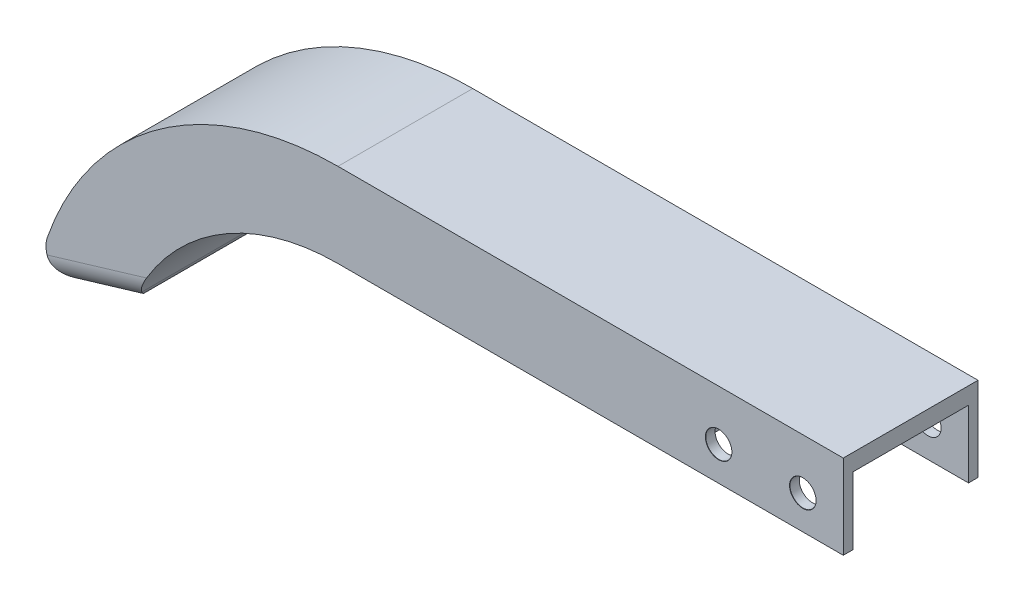
ISO-10303-21;
HEADER;
FILE_DESCRIPTION(('STEP AP214'),'2;1');
FILE_NAME('part.step','',(''),(''),'','','');
FILE_SCHEMA(('AUTOMOTIVE_DESIGN { 1 0 10303 214 1 1 1 1 }'));
ENDSEC;
DATA;
#1=APPLICATION_CONTEXT('core data for automotive mechanical design processes');
#2=APPLICATION_PROTOCOL_DEFINITION('international standard','automotive_design',2000,#1);
#3=PRODUCT_CONTEXT('',#1,'mechanical');
#4=PRODUCT('Part','Part','',(#3));
#5=PRODUCT_RELATED_PRODUCT_CATEGORY('part','',(#4));
#6=PRODUCT_DEFINITION_FORMATION('','',#4);
#7=PRODUCT_DEFINITION_CONTEXT('part definition',#1,'design');
#8=PRODUCT_DEFINITION('design','',#6,#7);
#9=PRODUCT_DEFINITION_SHAPE('','',#8);
#10=(LENGTH_UNIT() NAMED_UNIT(*) SI_UNIT(.MILLI.,.METRE.));
#11=(NAMED_UNIT(*) PLANE_ANGLE_UNIT() SI_UNIT($,.RADIAN.));
#12=(NAMED_UNIT(*) SI_UNIT($,.STERADIAN.) SOLID_ANGLE_UNIT());
#13=UNCERTAINTY_MEASURE_WITH_UNIT(LENGTH_MEASURE(1.E-05),#10,'distance_accuracy_value','');
#14=(GEOMETRIC_REPRESENTATION_CONTEXT(3) GLOBAL_UNCERTAINTY_ASSIGNED_CONTEXT((#13)) GLOBAL_UNIT_ASSIGNED_CONTEXT((#10,
#11,#12)) REPRESENTATION_CONTEXT('',''));
#15=CARTESIAN_POINT('',(0.,0.,0.));
#16=DIRECTION('',(0.,0.,1.));
#17=DIRECTION('',(1.,0.,0.));
#18=AXIS2_PLACEMENT_3D('',#15,#16,#17);
#19=CARTESIAN_POINT('',(-30.,10.,8.));
#20=DIRECTION('',(0.,0.,-1.));
#21=DIRECTION('',(-1.,0.,0.));
#22=AXIS2_PLACEMENT_3D('',#19,#20,#21);
#23=PLANE('',#22);
#24=CARTESIAN_POINT('',(15.2,4.,8.));
#25=DIRECTION('',(0.,0.,1.));
#26=DIRECTION('',(1.,0.,0.));
#27=AXIS2_PLACEMENT_3D('',#24,#25,#26);
#28=CIRCLE('',#27,1.575);
#29=CARTESIAN_POINT('',(16.775,4.,8.));
#30=VERTEX_POINT('',#29);
#31=EDGE_CURVE('E164',#30,#30,#28,.T.);
#32=ORIENTED_EDGE('',*,*,#31,.F.);
#33=EDGE_LOOP('',(#32));
#34=FACE_BOUND('',#33,.T.);
#35=CARTESIAN_POINT('',(25.2,4.,8.));
#36=DIRECTION('',(0.,0.,1.));
#37=DIRECTION('',(1.,0.,0.));
#38=AXIS2_PLACEMENT_3D('',#35,#36,#37);
#39=CIRCLE('',#38,1.575);
#40=CARTESIAN_POINT('',(26.775,4.,8.));
#41=VERTEX_POINT('',#40);
#42=EDGE_CURVE('E388',#41,#41,#39,.T.);
#43=ORIENTED_EDGE('',*,*,#42,.F.);
#44=EDGE_LOOP('',(#43));
#45=FACE_BOUND('',#44,.T.);
#46=CARTESIAN_POINT('',(-30.,-26.5304551873512,8.));
#47=DIRECTION('',(0.,0.,1.));
#48=DIRECTION('',(1.,0.,0.));
#49=AXIS2_PLACEMENT_3D('',#46,#47,#48);
#50=CIRCLE('',#49,36.5304551873512);
#51=CARTESIAN_POINT('',(-30.,9.99999999999999,8.));
#52=VERTEX_POINT('',#51);
#53=CARTESIAN_POINT('',(-64.5073787930309,-14.5423375273783,8.));
#54=VERTEX_POINT('',#53);
#55=EDGE_CURVE('E147',#52,#54,#50,.T.);
#56=ORIENTED_EDGE('',*,*,#55,.T.);
#57=CARTESIAN_POINT('',(-61.6735204179254,-15.5268408081469,8.));
#58=DIRECTION('',(0.,0.,-1.));
#59=DIRECTION('',(-1.,0.,0.));
#60=AXIS2_PLACEMENT_3D('',#57,#58,#59);
#61=CIRCLE('',#60,3.);
#62=CARTESIAN_POINT('',(-64.5475818728086,-16.38694007774,8.));
#63=VERTEX_POINT('',#62);
#64=EDGE_CURVE('E13',#54,#63,#61,.F.);
#65=ORIENTED_EDGE('',*,*,#64,.T.);
#66=DIRECTION('',(0.958020484961071,0.286699756531034,0.));
#67=VECTOR('',#66,1.);
#68=CARTESIAN_POINT('',(-55.4352110843268,-13.6599477769602,8.));
#69=LINE('',#68,#67);
#70=CARTESIAN_POINT('',(-52.7318155012241,-12.8509224297474,8.));
#71=VERTEX_POINT('',#70);
#72=EDGE_CURVE('E56',#63,#71,#69,.T.);
#73=ORIENTED_EDGE('',*,*,#72,.T.);
#74=CARTESIAN_POINT('',(-30.,-26.5304551873512,8.));
#75=DIRECTION('',(0.,0.,-1.));
#76=DIRECTION('',(1.,0.,0.));
#77=AXIS2_PLACEMENT_3D('',#74,#75,#76);
#78=CIRCLE('',#77,26.5304551873512);
#79=CARTESIAN_POINT('',(-30.,0.,8.));
#80=VERTEX_POINT('',#79);
#81=EDGE_CURVE('E154',#71,#80,#78,.T.);
#82=ORIENTED_EDGE('',*,*,#81,.T.);
#83=DIRECTION('',(1.,0.,0.));
#84=VECTOR('',#83,1.);
#85=CARTESIAN_POINT('',(-30.,0.,8.));
#86=LINE('',#85,#84);
#87=CARTESIAN_POINT('',(30.,0.,8.));
#88=VERTEX_POINT('',#87);
#89=EDGE_CURVE('E186',#80,#88,#86,.T.);
#90=ORIENTED_EDGE('',*,*,#89,.T.);
#91=DIRECTION('',(0.,-1.,0.));
#92=VECTOR('',#91,1.);
#93=CARTESIAN_POINT('',(30.,10.,8.));
#94=LINE('',#93,#92);
#95=CARTESIAN_POINT('',(30.,10.,8.));
#96=VERTEX_POINT('',#95);
#97=EDGE_CURVE('E167',#96,#88,#94,.T.);
#98=ORIENTED_EDGE('',*,*,#97,.F.);
#99=DIRECTION('',(1.,0.,0.));
#100=VECTOR('',#99,1.);
#101=CARTESIAN_POINT('',(-30.,10.,8.));
#102=LINE('',#101,#100);
#103=EDGE_CURVE('E159',#52,#96,#102,.T.);
#104=ORIENTED_EDGE('',*,*,#103,.F.);
#105=EDGE_LOOP('',(#56,#65,#73,#82,#90,#98,#104));
#106=FACE_BOUND('',#105,.T.);
#107=ADVANCED_FACE('F45',(#34,#45,#106),#23,.F.);
#108=CARTESIAN_POINT('',(0.,10.,0.));
#109=DIRECTION('',(0.,1.,0.));
#110=DIRECTION('',(0.,0.,1.));
#111=AXIS2_PLACEMENT_3D('',#108,#109,#110);
#112=PLANE('',#111);
#113=DIRECTION('',(-1.,0.,0.));
#114=VECTOR('',#113,1.);
#115=CARTESIAN_POINT('',(-30.,10.,-8.));
#116=LINE('',#115,#114);
#117=CARTESIAN_POINT('',(30.,10.,-8.));
#118=VERTEX_POINT('',#117);
#119=CARTESIAN_POINT('',(-30.,9.99999999999999,-8.));
#120=VERTEX_POINT('',#119);
#121=EDGE_CURVE('E161',#118,#120,#116,.T.);
#122=ORIENTED_EDGE('',*,*,#121,.T.);
#123=DIRECTION('',(0.,0.,1.));
#124=VECTOR('',#123,1.);
#125=CARTESIAN_POINT('',(-30.,9.99999999999999,-8.));
#126=LINE('',#125,#124);
#127=EDGE_CURVE('E150',#120,#52,#126,.T.);
#128=ORIENTED_EDGE('',*,*,#127,.T.);
#129=ORIENTED_EDGE('',*,*,#103,.T.);
#130=DIRECTION('',(0.,0.,-1.));
#131=VECTOR('',#130,1.);
#132=CARTESIAN_POINT('',(30.,10.,-8.));
#133=LINE('',#132,#131);
#134=EDGE_CURVE('E175',#96,#118,#133,.T.);
#135=ORIENTED_EDGE('',*,*,#134,.T.);
#136=EDGE_LOOP('',(#122,#128,#129,#135));
#137=FACE_BOUND('',#136,.T.);
#138=ADVANCED_FACE('F157',(#137),#112,.T.);
#139=CARTESIAN_POINT('',(-30.,-100.27043880632,-8.));
#140=DIRECTION('',(-8.67813232164608E-07,0.,-0.999999999999623));
#141=DIRECTION('',(-0.999999999999624,0.,8.67813232164609E-07));
#142=AXIS2_PLACEMENT_3D('',#139,#140,#141);
#143=PLANE('',#142);
#144=CARTESIAN_POINT('',(-30.,-26.5304551873512,-8.));
#145=DIRECTION('',(-8.67813232164608E-07,0.,-0.999999999999623));
#146=DIRECTION('',(-0.999999999999624,0.,8.67813232164608E-07));
#147=AXIS2_PLACEMENT_3D('',#144,#145,#146);
#148=ELLIPSE('',#147,26.5304551873612,26.5304551873512);
#149=CARTESIAN_POINT('',(-30.,0.,-8.));
#150=VERTEX_POINT('',#149);
#151=CARTESIAN_POINT('',(-52.7318149293887,-12.8509214795061,-7.99998027303021));
#152=VERTEX_POINT('',#151);
#153=EDGE_CURVE('E218',#150,#152,#148,.F.);
#154=ORIENTED_EDGE('',*,*,#153,.T.);
#155=DIRECTION('',(-0.95802048496074,-0.286699756530935,8.31382853533999E-07));
#156=VECTOR('',#155,1.);
#157=CARTESIAN_POINT('',(-55.8794965871427,-13.7929050582309,-7.99997754143042));
#158=LINE('',#157,#156);
#159=CARTESIAN_POINT('',(-64.5475820868028,-16.3869393626683,-7.99997001915113));
#160=VERTEX_POINT('',#159);
#161=EDGE_CURVE('E225',#152,#160,#158,.T.);
#162=ORIENTED_EDGE('',*,*,#161,.T.);
#163=CARTESIAN_POINT('',(-61.6735204179254,-15.5268408081469,-7.99997251329987));
#164=DIRECTION('',(-8.67813232164608E-07,0.,-0.999999999999623));
#165=DIRECTION('',(-0.999999999999624,0.,8.67813232164609E-07));
#166=AXIS2_PLACEMENT_3D('',#163,#164,#165);
#167=CIRCLE('',#166,3.);
#168=CARTESIAN_POINT('',(-64.507378793031,-14.5423375273783,-7.99997005404008));
#169=VERTEX_POINT('',#168);
#170=EDGE_CURVE('E222',#160,#169,#167,.T.);
#171=ORIENTED_EDGE('',*,*,#170,.T.);
#172=CARTESIAN_POINT('',(-30.,-26.5304551873512,-8.));
#173=DIRECTION('',(-8.67813232164608E-07,0.,-0.999999999999623));
#174=DIRECTION('',(-0.999999999999624,0.,8.67813232164608E-07));
#175=AXIS2_PLACEMENT_3D('',#172,#173,#174);
#176=ELLIPSE('',#175,36.530455187365,36.5304551873512);
#177=EDGE_CURVE('E194',#169,#120,#176,.T.);
#178=ORIENTED_EDGE('',*,*,#177,.T.);
#179=DIRECTION('',(0.,-1.,0.));
#180=VECTOR('',#179,1.);
#181=CARTESIAN_POINT('',(-30.,10.,-8.));
#182=LINE('',#181,#180);
#183=EDGE_CURVE('E173',#120,#150,#182,.T.);
#184=ORIENTED_EDGE('',*,*,#183,.T.);
#185=EDGE_LOOP('',(#154,#162,#171,#178,#184));
#186=FACE_BOUND('',#185,.T.);
#187=ADVANCED_FACE('F273',(#186),#143,.T.);
#188=CARTESIAN_POINT('',(30.,10.,-8.));
#189=DIRECTION('',(-1.,0.,0.));
#190=DIRECTION('',(0.,0.,1.));
#191=AXIS2_PLACEMENT_3D('',#188,#189,#190);
#192=PLANE('',#191);
#193=DIRECTION('',(0.,-1.,0.));
#194=VECTOR('',#193,1.);
#195=CARTESIAN_POINT('',(30.,8.,-6.873));
#196=LINE('',#195,#194);
#197=CARTESIAN_POINT('',(30.,8.,-6.873));
#198=VERTEX_POINT('',#197);
#199=CARTESIAN_POINT('',(30.,0.,-6.873));
#200=VERTEX_POINT('',#199);
#201=EDGE_CURVE('E435',#198,#200,#196,.T.);
#202=ORIENTED_EDGE('',*,*,#201,.T.);
#203=DIRECTION('',(0.,0.,-1.));
#204=VECTOR('',#203,1.);
#205=CARTESIAN_POINT('',(30.,0.,-8.));
#206=LINE('',#205,#204);
#207=CARTESIAN_POINT('',(30.,0.,-8.));
#208=VERTEX_POINT('',#207);
#209=EDGE_CURVE('E185',#200,#208,#206,.T.);
#210=ORIENTED_EDGE('',*,*,#209,.T.);
#211=DIRECTION('',(0.,-1.,0.));
#212=VECTOR('',#211,1.);
#213=CARTESIAN_POINT('',(30.,10.,-8.));
#214=LINE('',#213,#212);
#215=EDGE_CURVE('E190',#118,#208,#214,.T.);
#216=ORIENTED_EDGE('',*,*,#215,.F.);
#217=ORIENTED_EDGE('',*,*,#134,.F.);
#218=ORIENTED_EDGE('',*,*,#97,.T.);
#219=CARTESIAN_POINT('',(30.,0.,6.873));
#220=VERTEX_POINT('',#219);
#221=EDGE_CURVE('E180',#88,#220,#206,.T.);
#222=ORIENTED_EDGE('',*,*,#221,.T.);
#223=DIRECTION('',(0.,-1.,0.));
#224=VECTOR('',#223,1.);
#225=CARTESIAN_POINT('',(30.,8.,6.873));
#226=LINE('',#225,#224);
#227=CARTESIAN_POINT('',(30.,8.,6.873));
#228=VERTEX_POINT('',#227);
#229=EDGE_CURVE('E417',#228,#220,#226,.T.);
#230=ORIENTED_EDGE('',*,*,#229,.F.);
#231=DIRECTION('',(0.,0.,-1.));
#232=VECTOR('',#231,1.);
#233=CARTESIAN_POINT('',(30.,8.,6.873));
#234=LINE('',#233,#232);
#235=EDGE_CURVE('E403',#228,#198,#234,.T.);
#236=ORIENTED_EDGE('',*,*,#235,.T.);
#237=EDGE_LOOP('',(#202,#210,#216,#217,#218,#222,#230,#236));
#238=FACE_BOUND('',#237,.T.);
#239=ADVANCED_FACE('F276',(#238),#192,.F.);
#240=CARTESIAN_POINT('',(0.,0.,0.));
#241=DIRECTION('',(0.,1.,0.));
#242=DIRECTION('',(0.,0.,1.));
#243=AXIS2_PLACEMENT_3D('',#240,#241,#242);
#244=PLANE('',#243);
#245=DIRECTION('',(-1.,0.,0.));
#246=VECTOR('',#245,1.);
#247=CARTESIAN_POINT('',(30.,0.,-6.873));
#248=LINE('',#247,#246);
#249=CARTESIAN_POINT('',(9.746,0.,-6.873));
#250=VERTEX_POINT('',#249);
#251=EDGE_CURVE('E402',#200,#250,#248,.T.);
#252=ORIENTED_EDGE('',*,*,#251,.T.);
#253=DIRECTION('',(0.,0.,1.));
#254=VECTOR('',#253,1.);
#255=CARTESIAN_POINT('',(9.746,0.,6.873));
#256=LINE('',#255,#254);
#257=CARTESIAN_POINT('',(9.746,0.,6.873));
#258=VERTEX_POINT('',#257);
#259=EDGE_CURVE('E421',#250,#258,#256,.T.);
#260=ORIENTED_EDGE('',*,*,#259,.T.);
#261=DIRECTION('',(1.,0.,0.));
#262=VECTOR('',#261,1.);
#263=CARTESIAN_POINT('',(30.,0.,6.873));
#264=LINE('',#263,#262);
#265=EDGE_CURVE('E408',#258,#220,#264,.T.);
#266=ORIENTED_EDGE('',*,*,#265,.T.);
#267=ORIENTED_EDGE('',*,*,#221,.F.);
#268=ORIENTED_EDGE('',*,*,#89,.F.);
#269=DIRECTION('',(0.,0.,1.));
#270=VECTOR('',#269,1.);
#271=CARTESIAN_POINT('',(-30.,0.,-8.));
#272=LINE('',#271,#270);
#273=EDGE_CURVE('E188',#150,#80,#272,.T.);
#274=ORIENTED_EDGE('',*,*,#273,.F.);
#275=DIRECTION('',(-1.,0.,0.));
#276=VECTOR('',#275,1.);
#277=CARTESIAN_POINT('',(-30.,0.,-8.));
#278=LINE('',#277,#276);
#279=EDGE_CURVE('E184',#208,#150,#278,.T.);
#280=ORIENTED_EDGE('',*,*,#279,.F.);
#281=ORIENTED_EDGE('',*,*,#209,.F.);
#282=EDGE_LOOP('',(#252,#260,#266,#267,#268,#274,#280,#281));
#283=FACE_BOUND('',#282,.T.);
#284=ADVANCED_FACE('F314',(#283),#244,.F.);
#285=CARTESIAN_POINT('',(-30.,10.,-8.));
#286=DIRECTION('',(0.,0.,1.));
#287=DIRECTION('',(1.,0.,0.));
#288=AXIS2_PLACEMENT_3D('',#285,#286,#287);
#289=PLANE('',#288);
#290=CARTESIAN_POINT('',(15.2,4.,-8.));
#291=DIRECTION('',(0.,0.,1.));
#292=DIRECTION('',(1.,0.,0.));
#293=AXIS2_PLACEMENT_3D('',#290,#291,#292);
#294=CIRCLE('',#293,1.55);
#295=CARTESIAN_POINT('',(16.75,4.,-8.));
#296=VERTEX_POINT('',#295);
#297=EDGE_CURVE('E205',#296,#296,#294,.T.);
#298=ORIENTED_EDGE('',*,*,#297,.T.);
#299=EDGE_LOOP('',(#298));
#300=FACE_BOUND('',#299,.T.);
#301=CARTESIAN_POINT('',(25.2,4.,-8.));
#302=DIRECTION('',(0.,0.,1.));
#303=DIRECTION('',(1.,0.,0.));
#304=AXIS2_PLACEMENT_3D('',#301,#302,#303);
#305=CIRCLE('',#304,1.55);
#306=CARTESIAN_POINT('',(26.75,4.,-8.));
#307=VERTEX_POINT('',#306);
#308=EDGE_CURVE('E200',#307,#307,#305,.T.);
#309=ORIENTED_EDGE('',*,*,#308,.T.);
#310=EDGE_LOOP('',(#309));
#311=FACE_BOUND('',#310,.T.);
#312=ORIENTED_EDGE('',*,*,#279,.T.);
#313=ORIENTED_EDGE('',*,*,#183,.F.);
#314=ORIENTED_EDGE('',*,*,#121,.F.);
#315=ORIENTED_EDGE('',*,*,#215,.T.);
#316=EDGE_LOOP('',(#312,#313,#314,#315));
#317=FACE_BOUND('',#316,.T.);
#318=ADVANCED_FACE('F310',(#300,#311,#317),#289,.F.);
#319=CARTESIAN_POINT('',(30.,8.,-6.873));
#320=DIRECTION('',(0.,0.,1.));
#321=DIRECTION('',(1.,0.,0.));
#322=AXIS2_PLACEMENT_3D('',#319,#320,#321);
#323=PLANE('',#322);
#324=CARTESIAN_POINT('',(15.2,4.,-6.873));
#325=DIRECTION('',(0.,0.,1.));
#326=DIRECTION('',(1.,0.,0.));
#327=AXIS2_PLACEMENT_3D('',#324,#325,#326);
#328=CIRCLE('',#327,1.55);
#329=CARTESIAN_POINT('',(16.75,4.,-6.873));
#330=VERTEX_POINT('',#329);
#331=EDGE_CURVE('E204',#330,#330,#328,.T.);
#332=ORIENTED_EDGE('',*,*,#331,.F.);
#333=EDGE_LOOP('',(#332));
#334=FACE_BOUND('',#333,.T.);
#335=CARTESIAN_POINT('',(25.2,4.,-6.873));
#336=DIRECTION('',(0.,0.,1.));
#337=DIRECTION('',(1.,0.,0.));
#338=AXIS2_PLACEMENT_3D('',#335,#336,#337);
#339=CIRCLE('',#338,1.55);
#340=CARTESIAN_POINT('',(26.75,4.,-6.873));
#341=VERTEX_POINT('',#340);
#342=EDGE_CURVE('E199',#341,#341,#339,.T.);
#343=ORIENTED_EDGE('',*,*,#342,.F.);
#344=EDGE_LOOP('',(#343));
#345=FACE_BOUND('',#344,.T.);
#346=ORIENTED_EDGE('',*,*,#251,.F.);
#347=ORIENTED_EDGE('',*,*,#201,.F.);
#348=DIRECTION('',(-1.,0.,0.));
#349=VECTOR('',#348,1.);
#350=CARTESIAN_POINT('',(30.,8.,-6.873));
#351=LINE('',#350,#349);
#352=CARTESIAN_POINT('',(9.746,8.,-6.873));
#353=VERTEX_POINT('',#352);
#354=EDGE_CURVE('E407',#198,#353,#351,.T.);
#355=ORIENTED_EDGE('',*,*,#354,.T.);
#356=DIRECTION('',(0.,-1.,0.));
#357=VECTOR('',#356,1.);
#358=CARTESIAN_POINT('',(9.746,8.,-6.873));
#359=LINE('',#358,#357);
#360=EDGE_CURVE('E433',#353,#250,#359,.T.);
#361=ORIENTED_EDGE('',*,*,#360,.T.);
#362=EDGE_LOOP('',(#346,#347,#355,#361));
#363=FACE_BOUND('',#362,.T.);
#364=ADVANCED_FACE('F306',(#334,#345,#363),#323,.T.);
#365=CARTESIAN_POINT('',(9.746,8.,6.873));
#366=DIRECTION('',(1.,0.,0.));
#367=DIRECTION('',(0.,0.,-1.));
#368=AXIS2_PLACEMENT_3D('',#365,#366,#367);
#369=PLANE('',#368);
#370=ORIENTED_EDGE('',*,*,#259,.F.);
#371=ORIENTED_EDGE('',*,*,#360,.F.);
#372=DIRECTION('',(0.,0.,1.));
#373=VECTOR('',#372,1.);
#374=CARTESIAN_POINT('',(9.746,8.,6.873));
#375=LINE('',#374,#373);
#376=CARTESIAN_POINT('',(9.746,8.,6.873));
#377=VERTEX_POINT('',#376);
#378=EDGE_CURVE('E411',#353,#377,#375,.T.);
#379=ORIENTED_EDGE('',*,*,#378,.T.);
#380=DIRECTION('',(0.,-1.,0.));
#381=VECTOR('',#380,1.);
#382=CARTESIAN_POINT('',(9.746,8.,6.873));
#383=LINE('',#382,#381);
#384=EDGE_CURVE('E430',#377,#258,#383,.T.);
#385=ORIENTED_EDGE('',*,*,#384,.T.);
#386=EDGE_LOOP('',(#370,#371,#379,#385));
#387=FACE_BOUND('',#386,.T.);
#388=ADVANCED_FACE('F302',(#387),#369,.T.);
#389=CARTESIAN_POINT('',(30.,8.,6.873));
#390=DIRECTION('',(0.,0.,-1.));
#391=DIRECTION('',(-1.,0.,0.));
#392=AXIS2_PLACEMENT_3D('',#389,#390,#391);
#393=PLANE('',#392);
#394=CARTESIAN_POINT('',(15.2,4.,6.873));
#395=DIRECTION('',(0.,0.,-1.));
#396=DIRECTION('',(-1.,0.,0.));
#397=AXIS2_PLACEMENT_3D('',#394,#395,#396);
#398=CIRCLE('',#397,1.55);
#399=CARTESIAN_POINT('',(13.65,4.,6.873));
#400=VERTEX_POINT('',#399);
#401=EDGE_CURVE('E201',#400,#400,#398,.T.);
#402=ORIENTED_EDGE('',*,*,#401,.F.);
#403=EDGE_LOOP('',(#402));
#404=FACE_BOUND('',#403,.T.);
#405=CARTESIAN_POINT('',(25.2,4.,6.873));
#406=DIRECTION('',(0.,0.,-1.));
#407=DIRECTION('',(-1.,0.,0.));
#408=AXIS2_PLACEMENT_3D('',#405,#406,#407);
#409=CIRCLE('',#408,1.55);
#410=CARTESIAN_POINT('',(23.65,4.,6.873));
#411=VERTEX_POINT('',#410);
#412=EDGE_CURVE('E195',#411,#411,#409,.T.);
#413=ORIENTED_EDGE('',*,*,#412,.F.);
#414=EDGE_LOOP('',(#413));
#415=FACE_BOUND('',#414,.T.);
#416=ORIENTED_EDGE('',*,*,#265,.F.);
#417=ORIENTED_EDGE('',*,*,#384,.F.);
#418=DIRECTION('',(1.,0.,0.));
#419=VECTOR('',#418,1.);
#420=CARTESIAN_POINT('',(30.,8.,6.873));
#421=LINE('',#420,#419);
#422=EDGE_CURVE('E414',#377,#228,#421,.T.);
#423=ORIENTED_EDGE('',*,*,#422,.T.);
#424=ORIENTED_EDGE('',*,*,#229,.T.);
#425=EDGE_LOOP('',(#416,#417,#423,#424));
#426=FACE_BOUND('',#425,.T.);
#427=ADVANCED_FACE('F298',(#404,#415,#426),#393,.T.);
#428=CARTESIAN_POINT('',(0.,8.,0.));
#429=DIRECTION('',(0.,1.,0.));
#430=DIRECTION('',(0.,0.,1.));
#431=AXIS2_PLACEMENT_3D('',#428,#429,#430);
#432=PLANE('',#431);
#433=ORIENTED_EDGE('',*,*,#235,.F.);
#434=ORIENTED_EDGE('',*,*,#422,.F.);
#435=ORIENTED_EDGE('',*,*,#378,.F.);
#436=ORIENTED_EDGE('',*,*,#354,.F.);
#437=EDGE_LOOP('',(#433,#434,#435,#436));
#438=FACE_BOUND('',#437,.T.);
#439=ADVANCED_FACE('F294',(#438),#432,.F.);
#440=CARTESIAN_POINT('',(25.2,4.,8.));
#441=DIRECTION('',(0.,0.,1.));
#442=DIRECTION('',(1.,0.,0.));
#443=AXIS2_PLACEMENT_3D('',#440,#441,#442);
#444=CYLINDRICAL_SURFACE('',#443,1.55);
#445=ORIENTED_EDGE('',*,*,#412,.T.);
#446=EDGE_LOOP('',(#445));
#447=FACE_BOUND('',#446,.T.);
#448=CARTESIAN_POINT('',(25.2,4.,7.975));
#449=DIRECTION('',(0.,0.,1.));
#450=DIRECTION('',(1.,0.,0.));
#451=AXIS2_PLACEMENT_3D('',#448,#449,#450);
#452=CIRCLE('',#451,1.55);
#453=CARTESIAN_POINT('',(26.75,4.,7.975));
#454=VERTEX_POINT('',#453);
#455=EDGE_CURVE('E392',#454,#454,#452,.T.);
#456=ORIENTED_EDGE('',*,*,#455,.T.);
#457=EDGE_LOOP('',(#456));
#458=FACE_BOUND('',#457,.T.);
#459=ADVANCED_FACE('F290',(#447,#458),#444,.F.);
#460=CARTESIAN_POINT('',(25.2,4.,8.));
#461=DIRECTION('',(0.,0.,1.));
#462=DIRECTION('',(1.,0.,0.));
#463=AXIS2_PLACEMENT_3D('',#460,#461,#462);
#464=CONICAL_SURFACE('',#463,1.575,0.785398163397448);
#465=ORIENTED_EDGE('',*,*,#455,.F.);
#466=EDGE_LOOP('',(#465));
#467=FACE_BOUND('',#466,.T.);
#468=ORIENTED_EDGE('',*,*,#42,.T.);
#469=EDGE_LOOP('',(#468));
#470=FACE_BOUND('',#469,.T.);
#471=ADVANCED_FACE('F287',(#467,#470),#464,.F.);
#472=ORIENTED_EDGE('',*,*,#342,.T.);
#473=EDGE_LOOP('',(#472));
#474=FACE_BOUND('',#473,.T.);
#475=ORIENTED_EDGE('',*,*,#308,.F.);
#476=EDGE_LOOP('',(#475));
#477=FACE_BOUND('',#476,.T.);
#478=ADVANCED_FACE('F285',(#474,#477),#444,.F.);
#479=CARTESIAN_POINT('',(15.2,4.,8.));
#480=DIRECTION('',(0.,0.,1.));
#481=DIRECTION('',(1.,0.,0.));
#482=AXIS2_PLACEMENT_3D('',#479,#480,#481);
#483=CYLINDRICAL_SURFACE('',#482,1.55);
#484=ORIENTED_EDGE('',*,*,#401,.T.);
#485=EDGE_LOOP('',(#484));
#486=FACE_BOUND('',#485,.T.);
#487=CARTESIAN_POINT('',(15.2,4.,7.975));
#488=DIRECTION('',(0.,0.,1.));
#489=DIRECTION('',(1.,0.,0.));
#490=AXIS2_PLACEMENT_3D('',#487,#488,#489);
#491=CIRCLE('',#490,1.55);
#492=CARTESIAN_POINT('',(16.75,4.,7.975));
#493=VERTEX_POINT('',#492);
#494=EDGE_CURVE('E378',#493,#493,#491,.T.);
#495=ORIENTED_EDGE('',*,*,#494,.T.);
#496=EDGE_LOOP('',(#495));
#497=FACE_BOUND('',#496,.T.);
#498=ADVANCED_FACE('F281',(#486,#497),#483,.F.);
#499=CARTESIAN_POINT('',(15.2,4.,8.));
#500=DIRECTION('',(0.,0.,1.));
#501=DIRECTION('',(1.,0.,0.));
#502=AXIS2_PLACEMENT_3D('',#499,#500,#501);
#503=CONICAL_SURFACE('',#502,1.575,0.785398163397518);
#504=ORIENTED_EDGE('',*,*,#494,.F.);
#505=EDGE_LOOP('',(#504));
#506=FACE_BOUND('',#505,.T.);
#507=ORIENTED_EDGE('',*,*,#31,.T.);
#508=EDGE_LOOP('',(#507));
#509=FACE_BOUND('',#508,.T.);
#510=ADVANCED_FACE('F278',(#506,#509),#503,.F.);
#511=ORIENTED_EDGE('',*,*,#331,.T.);
#512=EDGE_LOOP('',(#511));
#513=FACE_BOUND('',#512,.T.);
#514=ORIENTED_EDGE('',*,*,#297,.F.);
#515=EDGE_LOOP('',(#514));
#516=FACE_BOUND('',#515,.T.);
#517=ADVANCED_FACE('F265',(#513,#516),#483,.F.);
#518=CARTESIAN_POINT('',(-30.,-26.5304551873512,-8.));
#519=DIRECTION('',(0.,0.,1.));
#520=DIRECTION('',(1.,0.,0.));
#521=AXIS2_PLACEMENT_3D('',#518,#519,#520);
#522=CYLINDRICAL_SURFACE('',#521,26.5304551873512);
#523=DIRECTION('',(0.,0.,1.));
#524=VECTOR('',#523,1.);
#525=CARTESIAN_POINT('',(-54.0482443920811,-15.3256796828268,-8.));
#526=LINE('',#525,#524);
#527=CARTESIAN_POINT('',(-54.0482443920811,-15.3256796828268,7.24191076321423));
#528=VERTEX_POINT('',#527);
#529=CARTESIAN_POINT('',(-54.0482443920811,-15.3256796828268,-7.24188939785558));
#530=VERTEX_POINT('',#529);
#531=EDGE_CURVE('E242',#528,#530,#526,.F.);
#532=ORIENTED_EDGE('',*,*,#531,.T.);
#533=CARTESIAN_POINT('',(-54.0482443920811,-15.3256796828268,-7.24188939785558));
#534=CARTESIAN_POINT('',(-54.0027125471272,-15.227928323454,-7.31353220810252));
#535=CARTESIAN_POINT('',(-53.9550214843148,-15.127154751485,-7.37946173744492));
#536=CARTESIAN_POINT('',(-53.8558815758941,-14.9211990721071,-7.50028527989248));
#537=CARTESIAN_POINT('',(-53.8044393235533,-14.8160248319182,-7.55519804814814));
#538=CARTESIAN_POINT('',(-53.6993410280498,-14.6048545305299,-7.65355209374771));
#539=CARTESIAN_POINT('',(-53.6457564345268,-14.4989248445912,-7.69721477690792));
#540=CARTESIAN_POINT('',(-53.5357212525176,-14.2850752437605,-7.7751391891813));
#541=CARTESIAN_POINT('',(-53.4792695903327,-14.1771545930437,-7.8093973651431));
#542=CARTESIAN_POINT('',(-53.3683803071308,-13.9687402263823,-7.86668523696934));
#543=CARTESIAN_POINT('',(-53.3141319228654,-13.8683277934441,-7.890384807651));
#544=CARTESIAN_POINT('',(-53.2037324934105,-13.6671344962405,-7.93063418972388));
#545=CARTESIAN_POINT('',(-53.1475815876705,-13.5663536594592,-7.94718452391715));
#546=CARTESIAN_POINT('',(-53.0324085842629,-13.362799738278,-7.9737813051953));
#547=CARTESIAN_POINT('',(-52.9733511547179,-13.2600284334836,-7.98368657426597));
#548=CARTESIAN_POINT('',(-52.8536936274383,-13.0550004584641,-7.99678081410749));
#549=CARTESIAN_POINT('',(-52.7930940646948,-12.9527436241168,-7.99997208277431));
#550=CARTESIAN_POINT('',(-52.7318149293887,-12.8509214795061,-7.99998027303021));
#551=B_SPLINE_CURVE_WITH_KNOTS('',3,(#533,#534,#535,#536,#537,#538,#539,#540,#541,#542,#543,
#544,#545,#546,#547,#548,#549,#550),.UNSPECIFIED.,.F.,.F.,(4,2,2,2,2,2,2,2,4),(0.,
0.388043197453773,0.775420069622559,1.15446186716195,1.53364667539615,1.88309485322831,
2.23251747264432,2.58914668977799,2.94565382913499),.UNSPECIFIED.);
#552=EDGE_CURVE('E253',#530,#152,#551,.T.);
#553=ORIENTED_EDGE('',*,*,#552,.T.);
#554=ORIENTED_EDGE('',*,*,#153,.F.);
#555=ORIENTED_EDGE('',*,*,#273,.T.);
#556=ORIENTED_EDGE('',*,*,#81,.F.);
#557=CARTESIAN_POINT('',(-52.7318155012241,-12.8509224297474,8.));
#558=CARTESIAN_POINT('',(-52.8161845646895,-12.99109200146,7.99997153776785));
#559=CARTESIAN_POINT('',(-52.899275710898,-13.1321319163647,7.99393428353648));
#560=CARTESIAN_POINT('',(-53.0625521914011,-13.4151860048922,7.96885989689097));
#561=CARTESIAN_POINT('',(-53.1427298927015,-13.5572017201359,7.94979089229325));
#562=CARTESIAN_POINT('',(-53.2970892554013,-13.8365423096874,7.89843352256255));
#563=CARTESIAN_POINT('',(-53.3713781795055,-13.973881519675,7.86655348481565));
#564=CARTESIAN_POINT('',(-53.5158208533666,-14.2465220841688,7.78863890156726));
#565=CARTESIAN_POINT('',(-53.5859793232503,-14.3818256278833,7.74262090181702));
#566=CARTESIAN_POINT('',(-53.7248829846001,-14.6552932946418,7.63272009618396));
#567=CARTESIAN_POINT('',(-53.7933943996086,-14.7932776354841,7.56807876345042));
#568=CARTESIAN_POINT('',(-53.9253076304004,-15.0644927118139,7.4197285305971));
#569=CARTESIAN_POINT('',(-53.9886122614028,-15.197614707955,7.33573602317073));
#570=CARTESIAN_POINT('',(-54.0482443920811,-15.3256796828268,7.24191076321423));
#571=B_SPLINE_CURVE_WITH_KNOTS('',3,(#557,#558,#559,#560,#561,#562,#563,#564,#565,#566,#567,
#568,#569,#570),.UNSPECIFIED.,.F.,.F.,(4,2,2,2,2,2,4),(0.,0.490820969489179,0.982846672460872,
1.46029720791704,1.93719109468605,2.43722606494983,2.94511686545118),.UNSPECIFIED.);
#572=EDGE_CURVE('E245',#71,#528,#571,.T.);
#573=ORIENTED_EDGE('',*,*,#572,.T.);
#574=EDGE_LOOP('',(#532,#553,#554,#555,#556,#573));
#575=FACE_BOUND('',#574,.T.);
#576=ADVANCED_FACE('F260',(#575),#522,.F.);
#577=CARTESIAN_POINT('',(-54.5751118147337,-16.5340092318434,-8.));
#578=DIRECTION('',(0.286699756531034,-0.958020484961071,0.));
#579=DIRECTION('',(0.958020484961071,0.286699756531034,0.));
#580=AXIS2_PLACEMENT_3D('',#577,#578,#579);
#581=PLANE('',#580);
#582=DIRECTION('',(0.,0.,1.));
#583=VECTOR('',#582,1.);
#584=CARTESIAN_POINT('',(-60.8134211483323,-18.4009022630301,-8.));
#585=LINE('',#584,#583);
#586=CARTESIAN_POINT('',(-60.8134211483323,-18.4009022630301,5.));
#587=VERTEX_POINT('',#586);
#588=CARTESIAN_POINT('',(-60.8134211483323,-18.4009022630301,-4.99997251329874));
#589=VERTEX_POINT('',#588);
#590=EDGE_CURVE('E235',#587,#589,#585,.F.);
#591=ORIENTED_EDGE('',*,*,#590,.T.);
#592=DIRECTION('',(-0.95802048496074,-0.286699756530935,8.31382853533999E-07));
#593=VECTOR('',#592,1.);
#594=CARTESIAN_POINT('',(-54.5751094252707,-16.5340085167663,-4.9999779269882));
#595=LINE('',#594,#593);
#596=CARTESIAN_POINT('',(-55.9074627017295,-16.9327320993728,-4.9999767707544));
#597=VERTEX_POINT('',#596);
#598=EDGE_CURVE('E238',#589,#597,#595,.F.);
#599=ORIENTED_EDGE('',*,*,#598,.T.);
#600=DIRECTION('',(0.,0.,1.));
#601=VECTOR('',#600,1.);
#602=CARTESIAN_POINT('',(-55.9074627017295,-16.9327320993728,-8.));
#603=LINE('',#602,#601);
#604=CARTESIAN_POINT('',(-55.9074627017295,-16.9327320993728,5.));
#605=VERTEX_POINT('',#604);
#606=EDGE_CURVE('E229',#597,#605,#603,.T.);
#607=ORIENTED_EDGE('',*,*,#606,.T.);
#608=DIRECTION('',(0.958020484961071,0.286699756531034,0.));
#609=VECTOR('',#608,1.);
#610=CARTESIAN_POINT('',(-65.929573082017,-19.9319754882783,5.));
#611=LINE('',#610,#609);
#612=EDGE_CURVE('E232',#605,#587,#611,.F.);
#613=ORIENTED_EDGE('',*,*,#612,.T.);
#614=EDGE_LOOP('',(#591,#599,#607,#613));
#615=FACE_BOUND('',#614,.T.);
#616=ADVANCED_FACE('F264',(#615),#581,.T.);
#617=CARTESIAN_POINT('',(-30.,-26.5304551873512,-8.));
#618=DIRECTION('',(0.,0.,1.));
#619=DIRECTION('',(1.,0.,0.));
#620=AXIS2_PLACEMENT_3D('',#617,#618,#619);
#621=CYLINDRICAL_SURFACE('',#620,36.5304551873512);
#622=ORIENTED_EDGE('',*,*,#177,.F.);
#623=DIRECTION('',(0.,0.,1.));
#624=VECTOR('',#623,1.);
#625=CARTESIAN_POINT('',(-64.5073787930309,-14.5423375273783,-8.));
#626=LINE('',#625,#624);
#627=EDGE_CURVE('E70',#169,#54,#626,.T.);
#628=ORIENTED_EDGE('',*,*,#627,.T.);
#629=ORIENTED_EDGE('',*,*,#55,.F.);
#630=ORIENTED_EDGE('',*,*,#127,.F.);
#631=EDGE_LOOP('',(#622,#628,#629,#630));
#632=FACE_BOUND('',#631,.T.);
#633=ADVANCED_FACE('F149',(#632),#621,.T.);
#634=CARTESIAN_POINT('',(-25.5921501271096,-4.72903403880284,5.));
#635=DIRECTION('',(-0.958020484961071,-0.286699756531034,0.));
#636=DIRECTION('',(0.286699756531034,-0.958020484961071,0.));
#637=AXIS2_PLACEMENT_3D('',#634,#635,#636);
#638=CYLINDRICAL_SURFACE('',#637,3.);
#639=CARTESIAN_POINT('',(-61.6735204179254,-15.5268408081469,5.));
#640=DIRECTION('',(-0.677422781431598,-0.202727342007626,-0.707106781186547));
#641=DIRECTION('',(-0.677422781431598,-0.202727342007626,0.707106781186547));
#642=AXIS2_PLACEMENT_3D('',#639,#640,#641);
#643=ELLIPSE('',#642,4.24264068711928,3.);
#644=EDGE_CURVE('E349',#587,#63,#643,.T.);
#645=ORIENTED_EDGE('',*,*,#644,.F.);
#646=ORIENTED_EDGE('',*,*,#612,.F.);
#647=CARTESIAN_POINT('',(-56.7675619713226,-14.0586706444896,5.));
#648=DIRECTION('',(-0.677422781431598,-0.202727342007626,0.707106781186547));
#649=DIRECTION('',(0.677422781431598,0.202727342007626,0.707106781186547));
#650=AXIS2_PLACEMENT_3D('',#647,#648,#649);
#651=ELLIPSE('',#650,4.24264068711928,3.);
#652=EDGE_CURVE('E50',#528,#605,#651,.F.);
#653=ORIENTED_EDGE('',*,*,#652,.F.);
#654=ORIENTED_EDGE('',*,*,#572,.F.);
#655=ORIENTED_EDGE('',*,*,#72,.F.);
#656=EDGE_LOOP('',(#645,#646,#653,#654,#655));
#657=FACE_BOUND('',#656,.T.);
#658=ADVANCED_FACE('F47',(#657),#638,.T.);
#659=CARTESIAN_POINT('',(-56.7675619713226,-14.0586706444896,-8.));
#660=DIRECTION('',(0.,0.,1.));
#661=DIRECTION('',(1.,0.,0.));
#662=AXIS2_PLACEMENT_3D('',#659,#660,#661);
#663=CYLINDRICAL_SURFACE('',#662,3.);
#664=ORIENTED_EDGE('',*,*,#652,.T.);
#665=ORIENTED_EDGE('',*,*,#606,.F.);
#666=CARTESIAN_POINT('',(-56.7675619713226,-14.0586706444896,-4.9999767707544));
#667=DIRECTION('',(0.677423063030382,0.202727426279627,0.70710648724826));
#668=DIRECTION('',(-0.677422499832697,-0.202727257735591,0.707107075124713));
#669=AXIS2_PLACEMENT_3D('',#666,#667,#668);
#670=ELLIPSE('',#669,4.24264245074975,3.);
#671=EDGE_CURVE('E352',#530,#597,#670,.F.);
#672=ORIENTED_EDGE('',*,*,#671,.F.);
#673=ORIENTED_EDGE('',*,*,#531,.F.);
#674=EDGE_LOOP('',(#664,#665,#672,#673));
#675=FACE_BOUND('',#674,.T.);
#676=ADVANCED_FACE('F333',(#675),#663,.T.);
#677=CARTESIAN_POINT('',(-61.6735204179254,-15.5268408081469,-8.));
#678=DIRECTION('',(0.,0.,1.));
#679=DIRECTION('',(1.,0.,0.));
#680=AXIS2_PLACEMENT_3D('',#677,#678,#679);
#681=CYLINDRICAL_SURFACE('',#680,3.);
#682=ORIENTED_EDGE('',*,*,#627,.F.);
#683=ORIENTED_EDGE('',*,*,#170,.F.);
#684=CARTESIAN_POINT('',(-61.6735204179254,-15.5268408081469,-4.99997251329874));
#685=DIRECTION('',(-0.677422499832697,-0.202727257735591,0.707107075124713));
#686=DIRECTION('',(0.677423063030382,0.202727426279627,0.70710648724826));
#687=AXIS2_PLACEMENT_3D('',#684,#685,#686);
#688=ELLIPSE('',#687,4.24263892349103,3.);
#689=EDGE_CURVE('E356',#589,#160,#688,.F.);
#690=ORIENTED_EDGE('',*,*,#689,.F.);
#691=ORIENTED_EDGE('',*,*,#590,.F.);
#692=ORIENTED_EDGE('',*,*,#644,.T.);
#693=ORIENTED_EDGE('',*,*,#64,.F.);
#694=EDGE_LOOP('',(#682,#683,#690,#691,#692,#693));
#695=FACE_BOUND('',#694,.T.);
#696=ADVANCED_FACE('F330',(#695),#681,.T.);
#697=CARTESIAN_POINT('',(-55.879493983703,-13.7929050582309,-4.99997754143155));
#698=DIRECTION('',(-0.95802048496074,-0.286699756530935,8.31382853533999E-07));
#699=DIRECTION('',(0.286699756531034,-0.958020484961071,0.));
#700=AXIS2_PLACEMENT_3D('',#697,#698,#699);
#701=CYLINDRICAL_SURFACE('',#700,3.);
#702=ORIENTED_EDGE('',*,*,#671,.T.);
#703=ORIENTED_EDGE('',*,*,#598,.F.);
#704=ORIENTED_EDGE('',*,*,#689,.T.);
#705=ORIENTED_EDGE('',*,*,#161,.F.);
#706=ORIENTED_EDGE('',*,*,#552,.F.);
#707=EDGE_LOOP('',(#702,#703,#704,#705,#706));
#708=FACE_BOUND('',#707,.T.);
#709=ADVANCED_FACE('F326',(#708),#701,.T.);
#710=CLOSED_SHELL('',(#107,#138,#187,#239,#284,#318,#364,#388,#427,#439,#459,#471,#478,#498,
#510,#517,#576,#616,#633,#658,#676,#696,#709));
#711=MANIFOLD_SOLID_BREP('B2',#710);
#712=ADVANCED_BREP_SHAPE_REPRESENTATION('',(#18,#711),#14);
#713=SHAPE_DEFINITION_REPRESENTATION(#9,#712);
ENDSEC;
END-ISO-10303-21;
